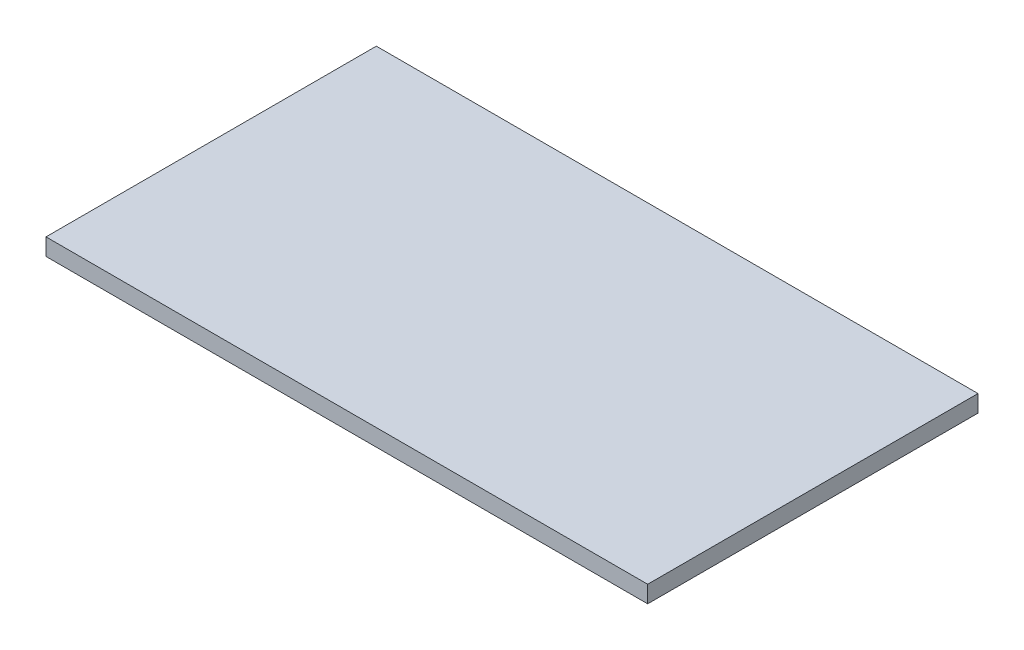
ISO-10303-21;
HEADER;
FILE_DESCRIPTION(('STEP AP214'),'2;1');
FILE_NAME('part.step','',(''),(''),'','','');
FILE_SCHEMA(('AUTOMOTIVE_DESIGN { 1 0 10303 214 1 1 1 1 }'));
ENDSEC;
DATA;
#1=APPLICATION_CONTEXT('core data for automotive mechanical design processes');
#2=APPLICATION_PROTOCOL_DEFINITION('international standard','automotive_design',2000,#1);
#3=PRODUCT_CONTEXT('',#1,'mechanical');
#4=PRODUCT('Part','Part','',(#3));
#5=PRODUCT_RELATED_PRODUCT_CATEGORY('part','',(#4));
#6=PRODUCT_DEFINITION_FORMATION('','',#4);
#7=PRODUCT_DEFINITION_CONTEXT('part definition',#1,'design');
#8=PRODUCT_DEFINITION('design','',#6,#7);
#9=PRODUCT_DEFINITION_SHAPE('','',#8);
#10=(LENGTH_UNIT() NAMED_UNIT(*) SI_UNIT(.MILLI.,.METRE.));
#11=(NAMED_UNIT(*) PLANE_ANGLE_UNIT() SI_UNIT($,.RADIAN.));
#12=(NAMED_UNIT(*) SI_UNIT($,.STERADIAN.) SOLID_ANGLE_UNIT());
#13=UNCERTAINTY_MEASURE_WITH_UNIT(LENGTH_MEASURE(1.E-05),#10,'distance_accuracy_value','');
#14=(GEOMETRIC_REPRESENTATION_CONTEXT(3) GLOBAL_UNCERTAINTY_ASSIGNED_CONTEXT((#13)) GLOBAL_UNIT_ASSIGNED_CONTEXT((#10,
#11,#12)) REPRESENTATION_CONTEXT('',''));
#15=CARTESIAN_POINT('',(0.,0.,0.));
#16=DIRECTION('',(0.,0.,1.));
#17=DIRECTION('',(1.,0.,0.));
#18=AXIS2_PLACEMENT_3D('',#15,#16,#17);
#19=CARTESIAN_POINT('',(80.9625,4.572,-44.45));
#20=DIRECTION('',(-1.,0.,0.));
#21=DIRECTION('',(0.,0.,1.));
#22=AXIS2_PLACEMENT_3D('',#19,#20,#21);
#23=PLANE('',#22);
#24=DIRECTION('',(0.,0.,-1.));
#25=VECTOR('',#24,1.);
#26=CARTESIAN_POINT('',(80.9625,0.,-44.45));
#27=LINE('',#26,#25);
#28=CARTESIAN_POINT('',(80.9625,0.,44.45));
#29=VERTEX_POINT('',#28);
#30=CARTESIAN_POINT('',(80.9625,0.,-44.45));
#31=VERTEX_POINT('',#30);
#32=EDGE_CURVE('E107',#29,#31,#27,.T.);
#33=ORIENTED_EDGE('',*,*,#32,.T.);
#34=DIRECTION('',(0.,-1.,0.));
#35=VECTOR('',#34,1.);
#36=CARTESIAN_POINT('',(80.9625,4.572,-44.45));
#37=LINE('',#36,#35);
#38=CARTESIAN_POINT('',(80.9625,4.572,-44.45));
#39=VERTEX_POINT('',#38);
#40=EDGE_CURVE('E11',#39,#31,#37,.T.);
#41=ORIENTED_EDGE('',*,*,#40,.F.);
#42=DIRECTION('',(0.,0.,-1.));
#43=VECTOR('',#42,1.);
#44=CARTESIAN_POINT('',(80.9625,4.572,-44.45));
#45=LINE('',#44,#43);
#46=CARTESIAN_POINT('',(80.9625,4.572,44.45));
#47=VERTEX_POINT('',#46);
#48=EDGE_CURVE('E91',#47,#39,#45,.T.);
#49=ORIENTED_EDGE('',*,*,#48,.F.);
#50=DIRECTION('',(0.,-1.,0.));
#51=VECTOR('',#50,1.);
#52=CARTESIAN_POINT('',(80.9625,4.572,44.45));
#53=LINE('',#52,#51);
#54=EDGE_CURVE('E103',#47,#29,#53,.T.);
#55=ORIENTED_EDGE('',*,*,#54,.T.);
#56=EDGE_LOOP('',(#33,#41,#49,#55));
#57=FACE_BOUND('',#56,.T.);
#58=ADVANCED_FACE('F39',(#57),#23,.F.);
#59=CARTESIAN_POINT('',(-80.9625,4.572,-44.45));
#60=DIRECTION('',(0.,0.,1.));
#61=DIRECTION('',(1.,0.,0.));
#62=AXIS2_PLACEMENT_3D('',#59,#60,#61);
#63=PLANE('',#62);
#64=DIRECTION('',(-1.,0.,0.));
#65=VECTOR('',#64,1.);
#66=CARTESIAN_POINT('',(-80.9625,0.,-44.45));
#67=LINE('',#66,#65);
#68=CARTESIAN_POINT('',(-80.9625,0.,-44.45));
#69=VERTEX_POINT('',#68);
#70=EDGE_CURVE('E96',#31,#69,#67,.T.);
#71=ORIENTED_EDGE('',*,*,#70,.T.);
#72=DIRECTION('',(0.,-1.,0.));
#73=VECTOR('',#72,1.);
#74=CARTESIAN_POINT('',(-80.9625,4.572,-44.45));
#75=LINE('',#74,#73);
#76=CARTESIAN_POINT('',(-80.9625,4.572,-44.45));
#77=VERTEX_POINT('',#76);
#78=EDGE_CURVE('E48',#77,#69,#75,.T.);
#79=ORIENTED_EDGE('',*,*,#78,.F.);
#80=DIRECTION('',(-1.,0.,0.));
#81=VECTOR('',#80,1.);
#82=CARTESIAN_POINT('',(-80.9625,4.572,-44.45));
#83=LINE('',#82,#81);
#84=EDGE_CURVE('E86',#39,#77,#83,.T.);
#85=ORIENTED_EDGE('',*,*,#84,.F.);
#86=ORIENTED_EDGE('',*,*,#40,.T.);
#87=EDGE_LOOP('',(#71,#79,#85,#86));
#88=FACE_BOUND('',#87,.T.);
#89=ADVANCED_FACE('F95',(#88),#63,.F.);
#90=CARTESIAN_POINT('',(-80.9625,4.572,-44.45));
#91=DIRECTION('',(1.,0.,0.));
#92=DIRECTION('',(0.,0.,-1.));
#93=AXIS2_PLACEMENT_3D('',#90,#91,#92);
#94=PLANE('',#93);
#95=DIRECTION('',(0.,0.,1.));
#96=VECTOR('',#95,1.);
#97=CARTESIAN_POINT('',(-80.9625,0.,-44.45));
#98=LINE('',#97,#96);
#99=CARTESIAN_POINT('',(-80.9625,0.,44.45));
#100=VERTEX_POINT('',#99);
#101=EDGE_CURVE('E73',#69,#100,#98,.T.);
#102=ORIENTED_EDGE('',*,*,#101,.T.);
#103=DIRECTION('',(0.,-1.,0.));
#104=VECTOR('',#103,1.);
#105=CARTESIAN_POINT('',(-80.9625,4.572,44.45));
#106=LINE('',#105,#104);
#107=CARTESIAN_POINT('',(-80.9625,4.572,44.45));
#108=VERTEX_POINT('',#107);
#109=EDGE_CURVE('E98',#108,#100,#106,.T.);
#110=ORIENTED_EDGE('',*,*,#109,.F.);
#111=DIRECTION('',(0.,0.,1.));
#112=VECTOR('',#111,1.);
#113=CARTESIAN_POINT('',(-80.9625,4.572,-44.45));
#114=LINE('',#113,#112);
#115=EDGE_CURVE('E89',#77,#108,#114,.T.);
#116=ORIENTED_EDGE('',*,*,#115,.F.);
#117=ORIENTED_EDGE('',*,*,#78,.T.);
#118=EDGE_LOOP('',(#102,#110,#116,#117));
#119=FACE_BOUND('',#118,.T.);
#120=ADVANCED_FACE('F99',(#119),#94,.F.);
#121=CARTESIAN_POINT('',(-80.9625,4.572,44.45));
#122=DIRECTION('',(0.,0.,-1.));
#123=DIRECTION('',(-1.,0.,0.));
#124=AXIS2_PLACEMENT_3D('',#121,#122,#123);
#125=PLANE('',#124);
#126=DIRECTION('',(1.,0.,0.));
#127=VECTOR('',#126,1.);
#128=CARTESIAN_POINT('',(-80.9625,0.,44.45));
#129=LINE('',#128,#127);
#130=EDGE_CURVE('E79',#100,#29,#129,.T.);
#131=ORIENTED_EDGE('',*,*,#130,.T.);
#132=ORIENTED_EDGE('',*,*,#54,.F.);
#133=DIRECTION('',(1.,0.,0.));
#134=VECTOR('',#133,1.);
#135=CARTESIAN_POINT('',(-80.9625,4.572,44.45));
#136=LINE('',#135,#134);
#137=EDGE_CURVE('E56',#108,#47,#136,.T.);
#138=ORIENTED_EDGE('',*,*,#137,.F.);
#139=ORIENTED_EDGE('',*,*,#109,.T.);
#140=EDGE_LOOP('',(#131,#132,#138,#139));
#141=FACE_BOUND('',#140,.T.);
#142=ADVANCED_FACE('F120',(#141),#125,.F.);
#143=CARTESIAN_POINT('',(0.,4.572,0.));
#144=DIRECTION('',(0.,1.,0.));
#145=DIRECTION('',(0.,0.,1.));
#146=AXIS2_PLACEMENT_3D('',#143,#144,#145);
#147=PLANE('',#146);
#148=ORIENTED_EDGE('',*,*,#48,.T.);
#149=ORIENTED_EDGE('',*,*,#84,.T.);
#150=ORIENTED_EDGE('',*,*,#115,.T.);
#151=ORIENTED_EDGE('',*,*,#137,.T.);
#152=EDGE_LOOP('',(#148,#149,#150,#151));
#153=FACE_BOUND('',#152,.T.);
#154=ADVANCED_FACE('F87',(#153),#147,.T.);
#155=CARTESIAN_POINT('',(0.,0.,0.));
#156=DIRECTION('',(0.,1.,0.));
#157=DIRECTION('',(0.,0.,1.));
#158=AXIS2_PLACEMENT_3D('',#155,#156,#157);
#159=PLANE('',#158);
#160=ORIENTED_EDGE('',*,*,#32,.F.);
#161=ORIENTED_EDGE('',*,*,#130,.F.);
#162=ORIENTED_EDGE('',*,*,#101,.F.);
#163=ORIENTED_EDGE('',*,*,#70,.F.);
#164=EDGE_LOOP('',(#160,#161,#162,#163));
#165=FACE_BOUND('',#164,.T.);
#166=ADVANCED_FACE('F123',(#165),#159,.F.);
#167=CLOSED_SHELL('',(#58,#89,#120,#142,#154,#166));
#168=MANIFOLD_SOLID_BREP('B2',#167);
#169=ADVANCED_BREP_SHAPE_REPRESENTATION('',(#18,#168),#14);
#170=SHAPE_DEFINITION_REPRESENTATION(#9,#169);
ENDSEC;
END-ISO-10303-21;
